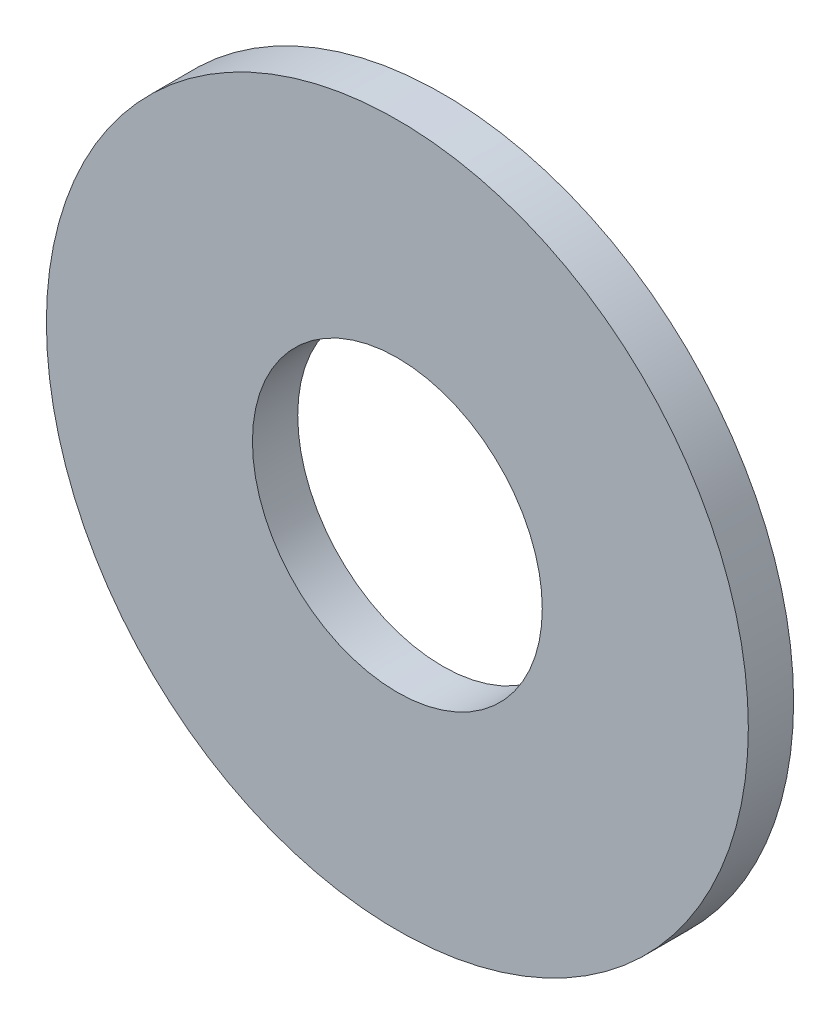
ISO-10303-21;
HEADER;
FILE_DESCRIPTION(('STEP AP214'),'2;1');
FILE_NAME('part.step','',(''),(''),'','','');
FILE_SCHEMA(('AUTOMOTIVE_DESIGN { 1 0 10303 214 1 1 1 1 }'));
ENDSEC;
DATA;
#1=APPLICATION_CONTEXT('core data for automotive mechanical design processes');
#2=APPLICATION_PROTOCOL_DEFINITION('international standard','automotive_design',2000,#1);
#3=PRODUCT_CONTEXT('',#1,'mechanical');
#4=PRODUCT('Part','Part','',(#3));
#5=PRODUCT_RELATED_PRODUCT_CATEGORY('part','',(#4));
#6=PRODUCT_DEFINITION_FORMATION('','',#4);
#7=PRODUCT_DEFINITION_CONTEXT('part definition',#1,'design');
#8=PRODUCT_DEFINITION('design','',#6,#7);
#9=PRODUCT_DEFINITION_SHAPE('','',#8);
#10=(LENGTH_UNIT() NAMED_UNIT(*) SI_UNIT(.MILLI.,.METRE.));
#11=(NAMED_UNIT(*) PLANE_ANGLE_UNIT() SI_UNIT($,.RADIAN.));
#12=(NAMED_UNIT(*) SI_UNIT($,.STERADIAN.) SOLID_ANGLE_UNIT());
#13=UNCERTAINTY_MEASURE_WITH_UNIT(LENGTH_MEASURE(1.E-05),#10,'distance_accuracy_value','');
#14=(GEOMETRIC_REPRESENTATION_CONTEXT(3) GLOBAL_UNCERTAINTY_ASSIGNED_CONTEXT((#13)) GLOBAL_UNIT_ASSIGNED_CONTEXT((#10,
#11,#12)) REPRESENTATION_CONTEXT('',''));
#15=CARTESIAN_POINT('',(0.,0.,0.));
#16=DIRECTION('',(0.,0.,1.));
#17=DIRECTION('',(1.,0.,0.));
#18=AXIS2_PLACEMENT_3D('',#15,#16,#17);
#19=CARTESIAN_POINT('',(0.,0.,6.35));
#20=DIRECTION('',(0.,0.,-1.));
#21=DIRECTION('',(-1.,0.,0.));
#22=AXIS2_PLACEMENT_3D('',#19,#20,#21);
#23=CYLINDRICAL_SURFACE('',#22,49.2125);
#24=CARTESIAN_POINT('',(0.,0.,6.35));
#25=DIRECTION('',(0.,0.,1.));
#26=DIRECTION('',(1.,0.,0.));
#27=AXIS2_PLACEMENT_3D('',#24,#25,#26);
#28=CIRCLE('',#27,49.2125);
#29=CARTESIAN_POINT('',(49.2125,0.,6.35));
#30=VERTEX_POINT('',#29);
#31=EDGE_CURVE('E10',#30,#30,#28,.T.);
#32=ORIENTED_EDGE('',*,*,#31,.F.);
#33=EDGE_LOOP('',(#32));
#34=FACE_BOUND('',#33,.T.);
#35=CARTESIAN_POINT('',(0.,0.,0.));
#36=DIRECTION('',(0.,0.,1.));
#37=DIRECTION('',(1.,0.,0.));
#38=AXIS2_PLACEMENT_3D('',#35,#36,#37);
#39=CIRCLE('',#38,49.2125);
#40=CARTESIAN_POINT('',(49.2125,0.,0.));
#41=VERTEX_POINT('',#40);
#42=EDGE_CURVE('E34',#41,#41,#39,.T.);
#43=ORIENTED_EDGE('',*,*,#42,.T.);
#44=EDGE_LOOP('',(#43));
#45=FACE_BOUND('',#44,.T.);
#46=ADVANCED_FACE('F31',(#34,#45),#23,.T.);
#47=CARTESIAN_POINT('',(0.,0.,6.35));
#48=DIRECTION('',(0.,0.,1.));
#49=DIRECTION('',(1.,0.,0.));
#50=AXIS2_PLACEMENT_3D('',#47,#48,#49);
#51=PLANE('',#50);
#52=CARTESIAN_POINT('',(0.,0.,6.35));
#53=DIRECTION('',(0.,0.,1.));
#54=DIRECTION('',(1.,0.,0.));
#55=AXIS2_PLACEMENT_3D('',#52,#53,#54);
#56=CIRCLE('',#55,20.32);
#57=CARTESIAN_POINT('',(20.32,0.,6.35));
#58=VERTEX_POINT('',#57);
#59=EDGE_CURVE('E45',#58,#58,#56,.T.);
#60=ORIENTED_EDGE('',*,*,#59,.F.);
#61=EDGE_LOOP('',(#60));
#62=FACE_BOUND('',#61,.T.);
#63=ORIENTED_EDGE('',*,*,#31,.T.);
#64=EDGE_LOOP('',(#63));
#65=FACE_BOUND('',#64,.T.);
#66=ADVANCED_FACE('F51',(#62,#65),#51,.T.);
#67=CARTESIAN_POINT('',(0.,0.,0.));
#68=DIRECTION('',(0.,0.,1.));
#69=DIRECTION('',(1.,0.,0.));
#70=AXIS2_PLACEMENT_3D('',#67,#68,#69);
#71=PLANE('',#70);
#72=CARTESIAN_POINT('',(0.,0.,0.));
#73=DIRECTION('',(0.,0.,1.));
#74=DIRECTION('',(1.,0.,0.));
#75=AXIS2_PLACEMENT_3D('',#72,#73,#74);
#76=CIRCLE('',#75,20.32);
#77=CARTESIAN_POINT('',(20.32,0.,0.));
#78=VERTEX_POINT('',#77);
#79=EDGE_CURVE('E41',#78,#78,#76,.F.);
#80=ORIENTED_EDGE('',*,*,#79,.F.);
#81=EDGE_LOOP('',(#80));
#82=FACE_BOUND('',#81,.T.);
#83=ORIENTED_EDGE('',*,*,#42,.F.);
#84=EDGE_LOOP('',(#83));
#85=FACE_BOUND('',#84,.T.);
#86=ADVANCED_FACE('F53',(#82,#85),#71,.F.);
#87=CARTESIAN_POINT('',(0.,0.,-57.4736391748426));
#88=DIRECTION('',(0.,0.,1.));
#89=DIRECTION('',(1.,0.,0.));
#90=AXIS2_PLACEMENT_3D('',#87,#88,#89);
#91=CYLINDRICAL_SURFACE('',#90,20.32);
#92=CARTESIAN_POINT('',(20.32,0.,0.));
#93=CARTESIAN_POINT('',(20.32,0.,0.0661458333333341));
#94=CARTESIAN_POINT('',(20.32,0.,0.132291666666668));
#95=CARTESIAN_POINT('',(20.32,0.,0.264583333333334));
#96=CARTESIAN_POINT('',(20.32,0.,0.330729166666666));
#97=CARTESIAN_POINT('',(20.32,0.,0.463020833333332));
#98=CARTESIAN_POINT('',(20.32,0.,0.529166666666666));
#99=CARTESIAN_POINT('',(20.32,0.,0.661458333333334));
#100=CARTESIAN_POINT('',(20.32,0.,0.727604166666669));
#101=CARTESIAN_POINT('',(20.32,0.,0.859895833333335));
#102=CARTESIAN_POINT('',(20.32,0.,0.926041666666666));
#103=CARTESIAN_POINT('',(20.32,0.,1.05833333333333));
#104=CARTESIAN_POINT('',(20.32,0.,1.12447916666667));
#105=CARTESIAN_POINT('',(20.32,0.,1.25677083333333));
#106=CARTESIAN_POINT('',(20.32,0.,1.32291666666667));
#107=CARTESIAN_POINT('',(20.32,0.,1.45520833333334));
#108=CARTESIAN_POINT('',(20.32,0.,1.52135416666667));
#109=CARTESIAN_POINT('',(20.32,0.,1.65364583333334));
#110=CARTESIAN_POINT('',(20.32,0.,1.71979166666667));
#111=CARTESIAN_POINT('',(20.32,0.,1.85208333333334));
#112=CARTESIAN_POINT('',(20.32,0.,1.91822916666667));
#113=CARTESIAN_POINT('',(20.32,0.,2.05052083333334));
#114=CARTESIAN_POINT('',(20.32,0.,2.11666666666667));
#115=CARTESIAN_POINT('',(20.32,0.,2.24895833333334));
#116=CARTESIAN_POINT('',(20.32,0.,2.31510416666667));
#117=CARTESIAN_POINT('',(20.32,0.,2.44739583333334));
#118=CARTESIAN_POINT('',(20.32,0.,2.51354166666667));
#119=CARTESIAN_POINT('',(20.32,0.,2.64583333333334));
#120=CARTESIAN_POINT('',(20.32,0.,2.71197916666667));
#121=CARTESIAN_POINT('',(20.32,0.,2.84427083333334));
#122=CARTESIAN_POINT('',(20.32,0.,2.91041666666667));
#123=CARTESIAN_POINT('',(20.32,0.,3.04270833333334));
#124=CARTESIAN_POINT('',(20.32,0.,3.10885416666667));
#125=CARTESIAN_POINT('',(20.32,0.,3.24114583333334));
#126=CARTESIAN_POINT('',(20.32,0.,3.30729166666667));
#127=CARTESIAN_POINT('',(20.32,0.,3.43958333333334));
#128=CARTESIAN_POINT('',(20.32,0.,3.50572916666667));
#129=CARTESIAN_POINT('',(20.32,0.,3.63802083333334));
#130=CARTESIAN_POINT('',(20.32,0.,3.70416666666667));
#131=CARTESIAN_POINT('',(20.32,0.,3.83645833333334));
#132=CARTESIAN_POINT('',(20.32,0.,3.90260416666667));
#133=CARTESIAN_POINT('',(20.32,0.,4.03489583333334));
#134=CARTESIAN_POINT('',(20.32,0.,4.10104166666667));
#135=CARTESIAN_POINT('',(20.32,0.,4.23333333333334));
#136=CARTESIAN_POINT('',(20.32,0.,4.29947916666667));
#137=CARTESIAN_POINT('',(20.32,0.,4.43177083333334));
#138=CARTESIAN_POINT('',(20.32,0.,4.49791666666667));
#139=CARTESIAN_POINT('',(20.32,0.,4.63020833333334));
#140=CARTESIAN_POINT('',(20.32,0.,4.69635416666667));
#141=CARTESIAN_POINT('',(20.32,0.,4.82864583333334));
#142=CARTESIAN_POINT('',(20.32,0.,4.89479166666667));
#143=CARTESIAN_POINT('',(20.32,0.,5.02708333333334));
#144=CARTESIAN_POINT('',(20.32,0.,5.09322916666667));
#145=CARTESIAN_POINT('',(20.32,0.,5.22552083333333));
#146=CARTESIAN_POINT('',(20.32,0.,5.29166666666666));
#147=CARTESIAN_POINT('',(20.32,0.,5.42395833333333));
#148=CARTESIAN_POINT('',(20.32,0.,5.49010416666667));
#149=CARTESIAN_POINT('',(20.32,0.,5.62239583333334));
#150=CARTESIAN_POINT('',(20.32,0.,5.68854166666667));
#151=CARTESIAN_POINT('',(20.32,0.,5.82083333333333));
#152=CARTESIAN_POINT('',(20.32,0.,5.88697916666666));
#153=CARTESIAN_POINT('',(20.32,0.,6.01927083333333));
#154=CARTESIAN_POINT('',(20.32,0.,6.08541666666667));
#155=CARTESIAN_POINT('',(20.32,0.,6.21770833333334));
#156=CARTESIAN_POINT('',(20.32,0.,6.28385416666667));
#157=CARTESIAN_POINT('',(20.32,0.,6.35));
#158=B_SPLINE_CURVE_WITH_KNOTS('',3,(#92,#93,#94,#95,#96,#97,#98,#99,#100,#101,#102,#103,#104,
#105,#106,#107,#108,#109,#110,#111,#112,#113,#114,#115,#116,#117,#118,#119,#120,#121,#122,#123,
#124,#125,#126,#127,#128,#129,#130,#131,#132,#133,#134,#135,#136,#137,#138,#139,#140,#141,#142,
#143,#144,#145,#146,#147,#148,#149,#150,#151,#152,#153,#154,#155,#156,#157),.UNSPECIFIED.,.F.,
.F.,(4,2,2,2,2,2,2,2,2,2,2,2,2,2,2,2,2,2,2,2,2,2,2,2,2,2,2,2,2,2,2,2,4),(0.,0.198437500000002,
0.396874999999998,0.5953125,0.793750000000003,0.992187499999998,1.190625,1.3890625,
1.58750000000001,1.7859375,1.984375,2.18281250000001,2.38125,2.5796875,2.77812500000001,
2.9765625,3.175,3.37343750000001,3.571875,3.7703125,3.96875000000001,4.1671875,4.365625,
4.56406250000001,4.7625,4.96093750000001,5.159375,5.3578125,5.55625000000001,5.7546875,5.953125,
6.15156250000001,6.35),.UNSPECIFIED.);
#159=EDGE_CURVE('BSEAM49',#78,#58,#158,.T.);
#160=ORIENTED_EDGE('',*,*,#79,.T.);
#161=ORIENTED_EDGE('',*,*,#59,.T.);
#162=ORIENTED_EDGE('',*,*,#159,.T.);
#163=ORIENTED_EDGE('',*,*,#159,.F.);
#164=EDGE_LOOP('',(#160,#162,#161,#163));
#165=FACE_BOUND('',#164,.T.);
#166=ADVANCED_FACE('F49',(#165),#91,.F.);
#167=CLOSED_SHELL('',(#46,#66,#86,#166));
#168=MANIFOLD_SOLID_BREP('B2',#167);
#169=ADVANCED_BREP_SHAPE_REPRESENTATION('',(#18,#168),#14);
#170=SHAPE_DEFINITION_REPRESENTATION(#9,#169);
ENDSEC;
END-ISO-10303-21;
